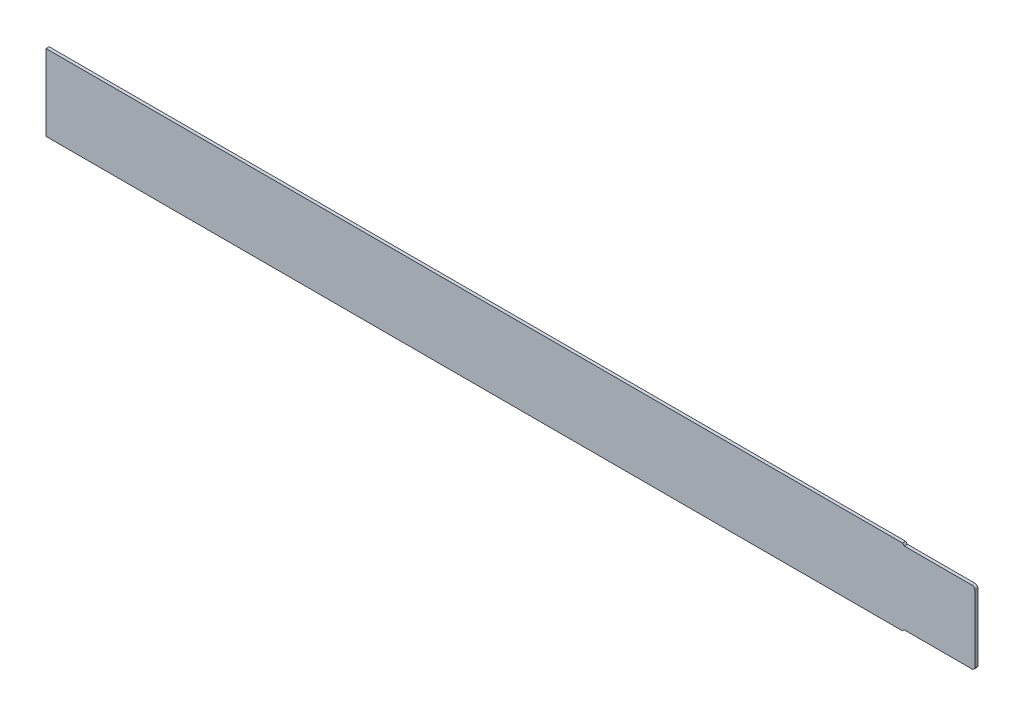
ISO-10303-21;
HEADER;
FILE_DESCRIPTION(('STEP AP214'),'2;1');
FILE_NAME('part.step','',(''),(''),'','','');
FILE_SCHEMA(('AUTOMOTIVE_DESIGN { 1 0 10303 214 1 1 1 1 }'));
ENDSEC;
DATA;
#1=APPLICATION_CONTEXT('core data for automotive mechanical design processes');
#2=APPLICATION_PROTOCOL_DEFINITION('international standard','automotive_design',2000,#1);
#3=PRODUCT_CONTEXT('',#1,'mechanical');
#4=PRODUCT('Part','Part','',(#3));
#5=PRODUCT_RELATED_PRODUCT_CATEGORY('part','',(#4));
#6=PRODUCT_DEFINITION_FORMATION('','',#4);
#7=PRODUCT_DEFINITION_CONTEXT('part definition',#1,'design');
#8=PRODUCT_DEFINITION('design','',#6,#7);
#9=PRODUCT_DEFINITION_SHAPE('','',#8);
#10=(LENGTH_UNIT() NAMED_UNIT(*) SI_UNIT(.MILLI.,.METRE.));
#11=(NAMED_UNIT(*) PLANE_ANGLE_UNIT() SI_UNIT($,.RADIAN.));
#12=(NAMED_UNIT(*) SI_UNIT($,.STERADIAN.) SOLID_ANGLE_UNIT());
#13=UNCERTAINTY_MEASURE_WITH_UNIT(LENGTH_MEASURE(1.E-05),#10,'distance_accuracy_value','');
#14=(GEOMETRIC_REPRESENTATION_CONTEXT(3) GLOBAL_UNCERTAINTY_ASSIGNED_CONTEXT((#13)) GLOBAL_UNIT_ASSIGNED_CONTEXT((#10,
#11,#12)) REPRESENTATION_CONTEXT('',''));
#15=CARTESIAN_POINT('',(0.,0.,0.));
#16=DIRECTION('',(0.,0.,1.));
#17=DIRECTION('',(1.,0.,0.));
#18=AXIS2_PLACEMENT_3D('',#15,#16,#17);
#19=CARTESIAN_POINT('',(0.,3.666,0.3));
#20=DIRECTION('',(0.,-1.,0.));
#21=DIRECTION('',(1.,0.,0.));
#22=AXIS2_PLACEMENT_3D('',#19,#20,#21);
#23=PLANE('',#22);
#24=DIRECTION('',(-1.,0.,0.));
#25=VECTOR('',#24,1.);
#26=CARTESIAN_POINT('',(0.,3.666,0.));
#27=LINE('',#26,#25);
#28=CARTESIAN_POINT('',(0.0340000000000052,3.666,0.));
#29=VERTEX_POINT('',#28);
#30=CARTESIAN_POINT('',(-82.5,3.66599999999999,0.));
#31=VERTEX_POINT('',#30);
#32=EDGE_CURVE('E68',#29,#31,#27,.T.);
#33=ORIENTED_EDGE('',*,*,#32,.T.);
#34=DIRECTION('',(0.,0.,-1.));
#35=VECTOR('',#34,1.);
#36=CARTESIAN_POINT('',(-82.5,3.66599999999999,0.3));
#37=LINE('',#36,#35);
#38=CARTESIAN_POINT('',(-82.5,3.66599999999999,0.3));
#39=VERTEX_POINT('',#38);
#40=EDGE_CURVE('E123',#39,#31,#37,.T.);
#41=ORIENTED_EDGE('',*,*,#40,.F.);
#42=DIRECTION('',(-1.,0.,0.));
#43=VECTOR('',#42,1.);
#44=CARTESIAN_POINT('',(0.,3.666,0.3));
#45=LINE('',#44,#43);
#46=CARTESIAN_POINT('',(0.0340000000000052,3.666,0.3));
#47=VERTEX_POINT('',#46);
#48=EDGE_CURVE('E60',#47,#39,#45,.T.);
#49=ORIENTED_EDGE('',*,*,#48,.F.);
#50=DIRECTION('',(0.,0.,1.));
#51=VECTOR('',#50,1.);
#52=CARTESIAN_POINT('',(0.0340000000000052,3.666,0.3));
#53=LINE('',#52,#51);
#54=EDGE_CURVE('E177',#47,#29,#53,.F.);
#55=ORIENTED_EDGE('',*,*,#54,.T.);
#56=EDGE_LOOP('',(#33,#41,#49,#55));
#57=FACE_BOUND('',#56,.T.);
#58=ADVANCED_FACE('F33',(#57),#23,.F.);
#59=CARTESIAN_POINT('',(-82.5,-3.66599999999999,0.3));
#60=DIRECTION('',(1.,0.,0.));
#61=DIRECTION('',(0.,0.,-1.));
#62=AXIS2_PLACEMENT_3D('',#59,#60,#61);
#63=PLANE('',#62);
#64=DIRECTION('',(0.,-1.,0.));
#65=VECTOR('',#64,1.);
#66=CARTESIAN_POINT('',(-82.5,-3.66599999999999,0.));
#67=LINE('',#66,#65);
#68=CARTESIAN_POINT('',(-82.5,-3.66599999999999,0.));
#69=VERTEX_POINT('',#68);
#70=EDGE_CURVE('E140',#31,#69,#67,.T.);
#71=ORIENTED_EDGE('',*,*,#70,.T.);
#72=DIRECTION('',(0.,0.,-1.));
#73=VECTOR('',#72,1.);
#74=CARTESIAN_POINT('',(-82.5,-3.66599999999999,0.3));
#75=LINE('',#74,#73);
#76=CARTESIAN_POINT('',(-82.5,-3.66599999999999,0.3));
#77=VERTEX_POINT('',#76);
#78=EDGE_CURVE('E126',#77,#69,#75,.T.);
#79=ORIENTED_EDGE('',*,*,#78,.F.);
#80=DIRECTION('',(0.,-1.,0.));
#81=VECTOR('',#80,1.);
#82=CARTESIAN_POINT('',(-82.5,-3.66599999999999,0.3));
#83=LINE('',#82,#81);
#84=EDGE_CURVE('E115',#39,#77,#83,.T.);
#85=ORIENTED_EDGE('',*,*,#84,.F.);
#86=ORIENTED_EDGE('',*,*,#40,.T.);
#87=EDGE_LOOP('',(#71,#79,#85,#86));
#88=FACE_BOUND('',#87,.T.);
#89=ADVANCED_FACE('F128',(#88),#63,.F.);
#90=CARTESIAN_POINT('',(0.,-3.666,0.3));
#91=DIRECTION('',(0.,1.,0.));
#92=DIRECTION('',(-1.,0.,0.));
#93=AXIS2_PLACEMENT_3D('',#90,#91,#92);
#94=PLANE('',#93);
#95=DIRECTION('',(1.,0.,0.));
#96=VECTOR('',#95,1.);
#97=CARTESIAN_POINT('',(0.,-3.666,0.));
#98=LINE('',#97,#96);
#99=CARTESIAN_POINT('',(0.0340000000000033,-3.666,0.));
#100=VERTEX_POINT('',#99);
#101=EDGE_CURVE('E142',#69,#100,#98,.T.);
#102=ORIENTED_EDGE('',*,*,#101,.T.);
#103=DIRECTION('',(0.,0.,-1.));
#104=VECTOR('',#103,1.);
#105=CARTESIAN_POINT('',(0.0340000000000033,-3.666,0.3));
#106=LINE('',#105,#104);
#107=CARTESIAN_POINT('',(0.0340000000000033,-3.666,0.3));
#108=VERTEX_POINT('',#107);
#109=EDGE_CURVE('E42',#100,#108,#106,.F.);
#110=ORIENTED_EDGE('',*,*,#109,.T.);
#111=DIRECTION('',(1.,0.,0.));
#112=VECTOR('',#111,1.);
#113=CARTESIAN_POINT('',(0.,-3.666,0.3));
#114=LINE('',#113,#112);
#115=EDGE_CURVE('E48',#77,#108,#114,.T.);
#116=ORIENTED_EDGE('',*,*,#115,.F.);
#117=ORIENTED_EDGE('',*,*,#78,.T.);
#118=EDGE_LOOP('',(#102,#110,#116,#117));
#119=FACE_BOUND('',#118,.T.);
#120=ADVANCED_FACE('F186',(#119),#94,.F.);
#121=CARTESIAN_POINT('',(0.,-3.5,0.3));
#122=DIRECTION('',(0.,1.,0.));
#123=DIRECTION('',(-1.,0.,0.));
#124=AXIS2_PLACEMENT_3D('',#121,#122,#123);
#125=PLANE('',#124);
#126=DIRECTION('',(1.,0.,0.));
#127=VECTOR('',#126,1.);
#128=CARTESIAN_POINT('',(0.,-3.5,0.3));
#129=LINE('',#128,#127);
#130=CARTESIAN_POINT('',(0.200000000000006,-3.5,0.3));
#131=VERTEX_POINT('',#130);
#132=CARTESIAN_POINT('',(6.7,-3.5,0.3));
#133=VERTEX_POINT('',#132);
#134=EDGE_CURVE('E131',#131,#133,#129,.T.);
#135=ORIENTED_EDGE('',*,*,#134,.F.);
#136=DIRECTION('',(0.,0.,-1.));
#137=VECTOR('',#136,1.);
#138=CARTESIAN_POINT('',(0.200000000000006,-3.5,0.));
#139=LINE('',#138,#137);
#140=CARTESIAN_POINT('',(0.200000000000006,-3.5,0.));
#141=VERTEX_POINT('',#140);
#142=EDGE_CURVE('E174',#131,#141,#139,.T.);
#143=ORIENTED_EDGE('',*,*,#142,.T.);
#144=DIRECTION('',(1.,0.,0.));
#145=VECTOR('',#144,1.);
#146=CARTESIAN_POINT('',(0.,-3.5,0.));
#147=LINE('',#146,#145);
#148=CARTESIAN_POINT('',(6.7,-3.5,0.));
#149=VERTEX_POINT('',#148);
#150=EDGE_CURVE('E144',#141,#149,#147,.T.);
#151=ORIENTED_EDGE('',*,*,#150,.T.);
#152=DIRECTION('',(0.,0.,-1.));
#153=VECTOR('',#152,1.);
#154=CARTESIAN_POINT('',(6.7,-3.5,0.3));
#155=LINE('',#154,#153);
#156=EDGE_CURVE('E168',#149,#133,#155,.F.);
#157=ORIENTED_EDGE('',*,*,#156,.T.);
#158=EDGE_LOOP('',(#135,#143,#151,#157));
#159=FACE_BOUND('',#158,.T.);
#160=ADVANCED_FACE('F192',(#159),#125,.F.);
#161=CARTESIAN_POINT('',(7.,3.5,0.3));
#162=DIRECTION('',(-1.,0.,0.));
#163=DIRECTION('',(0.,-1.,0.));
#164=AXIS2_PLACEMENT_3D('',#161,#162,#163);
#165=PLANE('',#164);
#166=DIRECTION('',(0.,1.,0.));
#167=VECTOR('',#166,1.);
#168=CARTESIAN_POINT('',(7.,3.5,0.));
#169=LINE('',#168,#167);
#170=CARTESIAN_POINT('',(7.,-3.2,0.));
#171=VERTEX_POINT('',#170);
#172=CARTESIAN_POINT('',(7.,3.2,0.));
#173=VERTEX_POINT('',#172);
#174=EDGE_CURVE('E146',#171,#173,#169,.T.);
#175=ORIENTED_EDGE('',*,*,#174,.T.);
#176=DIRECTION('',(0.,0.,-1.));
#177=VECTOR('',#176,1.);
#178=CARTESIAN_POINT('',(7.,3.2,0.3));
#179=LINE('',#178,#177);
#180=CARTESIAN_POINT('',(7.,3.2,0.3));
#181=VERTEX_POINT('',#180);
#182=EDGE_CURVE('E162',#173,#181,#179,.F.);
#183=ORIENTED_EDGE('',*,*,#182,.T.);
#184=DIRECTION('',(0.,1.,0.));
#185=VECTOR('',#184,1.);
#186=CARTESIAN_POINT('',(7.,3.5,0.3));
#187=LINE('',#186,#185);
#188=CARTESIAN_POINT('',(7.,-3.2,0.3));
#189=VERTEX_POINT('',#188);
#190=EDGE_CURVE('E135',#189,#181,#187,.T.);
#191=ORIENTED_EDGE('',*,*,#190,.F.);
#192=DIRECTION('',(0.,0.,-1.));
#193=VECTOR('',#192,1.);
#194=CARTESIAN_POINT('',(7.,-3.2,0.3));
#195=LINE('',#194,#193);
#196=EDGE_CURVE('E159',#189,#171,#195,.T.);
#197=ORIENTED_EDGE('',*,*,#196,.T.);
#198=EDGE_LOOP('',(#175,#183,#191,#197));
#199=FACE_BOUND('',#198,.T.);
#200=ADVANCED_FACE('F204',(#199),#165,.F.);
#201=CARTESIAN_POINT('',(0.,3.5,0.3));
#202=DIRECTION('',(0.,-1.,0.));
#203=DIRECTION('',(0.,0.,-1.));
#204=AXIS2_PLACEMENT_3D('',#201,#202,#203);
#205=PLANE('',#204);
#206=DIRECTION('',(-1.,0.,0.));
#207=VECTOR('',#206,1.);
#208=CARTESIAN_POINT('',(0.,3.5,0.));
#209=LINE('',#208,#207);
#210=CARTESIAN_POINT('',(6.7,3.5,0.));
#211=VERTEX_POINT('',#210);
#212=CARTESIAN_POINT('',(0.200000000000002,3.5,0.));
#213=VERTEX_POINT('',#212);
#214=EDGE_CURVE('E120',#211,#213,#209,.T.);
#215=ORIENTED_EDGE('',*,*,#214,.T.);
#216=DIRECTION('',(0.,0.,1.));
#217=VECTOR('',#216,1.);
#218=CARTESIAN_POINT('',(0.200000000000002,3.5,0.3));
#219=LINE('',#218,#217);
#220=CARTESIAN_POINT('',(0.200000000000002,3.5,0.3));
#221=VERTEX_POINT('',#220);
#222=EDGE_CURVE('E171',#213,#221,#219,.T.);
#223=ORIENTED_EDGE('',*,*,#222,.T.);
#224=DIRECTION('',(-1.,0.,0.));
#225=VECTOR('',#224,1.);
#226=CARTESIAN_POINT('',(0.,3.5,0.3));
#227=LINE('',#226,#225);
#228=CARTESIAN_POINT('',(6.7,3.5,0.3));
#229=VERTEX_POINT('',#228);
#230=EDGE_CURVE('E137',#229,#221,#227,.T.);
#231=ORIENTED_EDGE('',*,*,#230,.F.);
#232=DIRECTION('',(0.,0.,-1.));
#233=VECTOR('',#232,1.);
#234=CARTESIAN_POINT('',(6.7,3.5,0.3));
#235=LINE('',#234,#233);
#236=EDGE_CURVE('E125',#229,#211,#235,.T.);
#237=ORIENTED_EDGE('',*,*,#236,.T.);
#238=EDGE_LOOP('',(#215,#223,#231,#237));
#239=FACE_BOUND('',#238,.T.);
#240=ADVANCED_FACE('F211',(#239),#205,.F.);
#241=CARTESIAN_POINT('',(0.,0.,0.3));
#242=DIRECTION('',(0.,0.,1.));
#243=DIRECTION('',(1.,0.,0.));
#244=AXIS2_PLACEMENT_3D('',#241,#242,#243);
#245=PLANE('',#244);
#246=ORIENTED_EDGE('',*,*,#190,.T.);
#247=CARTESIAN_POINT('',(6.7,3.2,0.3));
#248=DIRECTION('',(0.,0.,1.));
#249=DIRECTION('',(1.,0.,0.));
#250=AXIS2_PLACEMENT_3D('',#247,#248,#249);
#251=CIRCLE('',#250,0.3);
#252=EDGE_CURVE('E166',#181,#229,#251,.T.);
#253=ORIENTED_EDGE('',*,*,#252,.T.);
#254=ORIENTED_EDGE('',*,*,#230,.T.);
#255=DIRECTION('',(0.707106781186543,-0.707106781186552,0.));
#256=VECTOR('',#255,1.);
#257=CARTESIAN_POINT('',(0.,3.70000000000001,0.3));
#258=LINE('',#257,#256);
#259=EDGE_CURVE('E118',#221,#47,#258,.F.);
#260=ORIENTED_EDGE('',*,*,#259,.T.);
#261=ORIENTED_EDGE('',*,*,#48,.T.);
#262=ORIENTED_EDGE('',*,*,#84,.T.);
#263=ORIENTED_EDGE('',*,*,#115,.T.);
#264=DIRECTION('',(-0.707106781186554,-0.707106781186541,0.));
#265=VECTOR('',#264,1.);
#266=CARTESIAN_POINT('',(0.200000000000005,-3.5,0.3));
#267=LINE('',#266,#265);
#268=EDGE_CURVE('E11',#108,#131,#267,.F.);
#269=ORIENTED_EDGE('',*,*,#268,.T.);
#270=ORIENTED_EDGE('',*,*,#134,.T.);
#271=CARTESIAN_POINT('',(6.7,-3.2,0.3));
#272=DIRECTION('',(0.,0.,1.));
#273=DIRECTION('',(1.,0.,0.));
#274=AXIS2_PLACEMENT_3D('',#271,#272,#273);
#275=CIRCLE('',#274,0.3);
#276=EDGE_CURVE('E164',#133,#189,#275,.T.);
#277=ORIENTED_EDGE('',*,*,#276,.T.);
#278=EDGE_LOOP('',(#246,#253,#254,#260,#261,#262,#263,#269,#270,#277));
#279=FACE_BOUND('',#278,.T.);
#280=ADVANCED_FACE('F113',(#279),#245,.T.);
#281=CARTESIAN_POINT('',(0.,0.,0.));
#282=DIRECTION('',(0.,0.,1.));
#283=DIRECTION('',(1.,0.,0.));
#284=AXIS2_PLACEMENT_3D('',#281,#282,#283);
#285=PLANE('',#284);
#286=ORIENTED_EDGE('',*,*,#214,.F.);
#287=CARTESIAN_POINT('',(6.7,3.2,0.));
#288=DIRECTION('',(0.,0.,1.));
#289=DIRECTION('',(1.,0.,0.));
#290=AXIS2_PLACEMENT_3D('',#287,#288,#289);
#291=CIRCLE('',#290,0.3);
#292=EDGE_CURVE('E157',#211,#173,#291,.F.);
#293=ORIENTED_EDGE('',*,*,#292,.T.);
#294=ORIENTED_EDGE('',*,*,#174,.F.);
#295=CARTESIAN_POINT('',(6.7,-3.2,0.));
#296=DIRECTION('',(0.,0.,1.));
#297=DIRECTION('',(1.,0.,0.));
#298=AXIS2_PLACEMENT_3D('',#295,#296,#297);
#299=CIRCLE('',#298,0.3);
#300=EDGE_CURVE('E154',#171,#149,#299,.F.);
#301=ORIENTED_EDGE('',*,*,#300,.T.);
#302=ORIENTED_EDGE('',*,*,#150,.F.);
#303=DIRECTION('',(0.707106781186554,0.707106781186541,0.));
#304=VECTOR('',#303,1.);
#305=CARTESIAN_POINT('',(1.85,-1.85000000000004,0.));
#306=LINE('',#305,#304);
#307=EDGE_CURVE('E182',#141,#100,#306,.F.);
#308=ORIENTED_EDGE('',*,*,#307,.T.);
#309=ORIENTED_EDGE('',*,*,#101,.F.);
#310=ORIENTED_EDGE('',*,*,#70,.F.);
#311=ORIENTED_EDGE('',*,*,#32,.F.);
#312=DIRECTION('',(-0.707106781186543,0.707106781186552,0.));
#313=VECTOR('',#312,1.);
#314=CARTESIAN_POINT('',(1.85,1.84999999999998,0.));
#315=LINE('',#314,#313);
#316=EDGE_CURVE('E179',#29,#213,#315,.F.);
#317=ORIENTED_EDGE('',*,*,#316,.T.);
#318=EDGE_LOOP('',(#286,#293,#294,#301,#302,#308,#309,#310,#311,#317));
#319=FACE_BOUND('',#318,.T.);
#320=ADVANCED_FACE('F194',(#319),#285,.F.);
#321=CARTESIAN_POINT('',(6.7,3.2,0.3));
#322=DIRECTION('',(0.,0.,-1.));
#323=DIRECTION('',(-1.,0.,0.));
#324=AXIS2_PLACEMENT_3D('',#321,#322,#323);
#325=CYLINDRICAL_SURFACE('',#324,0.3);
#326=ORIENTED_EDGE('',*,*,#252,.F.);
#327=ORIENTED_EDGE('',*,*,#182,.F.);
#328=ORIENTED_EDGE('',*,*,#292,.F.);
#329=ORIENTED_EDGE('',*,*,#236,.F.);
#330=EDGE_LOOP('',(#326,#327,#328,#329));
#331=FACE_BOUND('',#330,.T.);
#332=ADVANCED_FACE('F207',(#331),#325,.T.);
#333=CARTESIAN_POINT('',(6.7,-3.2,0.3));
#334=DIRECTION('',(0.,0.,-1.));
#335=DIRECTION('',(-1.,0.,0.));
#336=AXIS2_PLACEMENT_3D('',#333,#334,#335);
#337=CYLINDRICAL_SURFACE('',#336,0.3);
#338=ORIENTED_EDGE('',*,*,#276,.F.);
#339=ORIENTED_EDGE('',*,*,#156,.F.);
#340=ORIENTED_EDGE('',*,*,#300,.F.);
#341=ORIENTED_EDGE('',*,*,#196,.F.);
#342=EDGE_LOOP('',(#338,#339,#340,#341));
#343=FACE_BOUND('',#342,.T.);
#344=ADVANCED_FACE('F200',(#343),#337,.T.);
#345=CARTESIAN_POINT('',(0.,3.70000000000001,0.3));
#346=DIRECTION('',(0.707106781186552,0.707106781186543,0.));
#347=DIRECTION('',(0.,0.,1.));
#348=AXIS2_PLACEMENT_3D('',#345,#346,#347);
#349=PLANE('',#348);
#350=ORIENTED_EDGE('',*,*,#259,.F.);
#351=ORIENTED_EDGE('',*,*,#222,.F.);
#352=ORIENTED_EDGE('',*,*,#316,.F.);
#353=ORIENTED_EDGE('',*,*,#54,.F.);
#354=EDGE_LOOP('',(#350,#351,#352,#353));
#355=FACE_BOUND('',#354,.T.);
#356=ADVANCED_FACE('F215',(#355),#349,.T.);
#357=CARTESIAN_POINT('',(0.200000000000005,-3.5,0.3));
#358=DIRECTION('',(0.707106781186541,-0.707106781186554,0.));
#359=DIRECTION('',(0.,0.,1.));
#360=AXIS2_PLACEMENT_3D('',#357,#358,#359);
#361=PLANE('',#360);
#362=ORIENTED_EDGE('',*,*,#268,.F.);
#363=ORIENTED_EDGE('',*,*,#109,.F.);
#364=ORIENTED_EDGE('',*,*,#307,.F.);
#365=ORIENTED_EDGE('',*,*,#142,.F.);
#366=EDGE_LOOP('',(#362,#363,#364,#365));
#367=FACE_BOUND('',#366,.T.);
#368=ADVANCED_FACE('F35',(#367),#361,.T.);
#369=CLOSED_SHELL('',(#58,#89,#120,#160,#200,#240,#280,#320,#332,#344,#356,#368));
#370=MANIFOLD_SOLID_BREP('B2',#369);
#371=ADVANCED_BREP_SHAPE_REPRESENTATION('',(#18,#370),#14);
#372=SHAPE_DEFINITION_REPRESENTATION(#9,#371);
ENDSEC;
END-ISO-10303-21;
